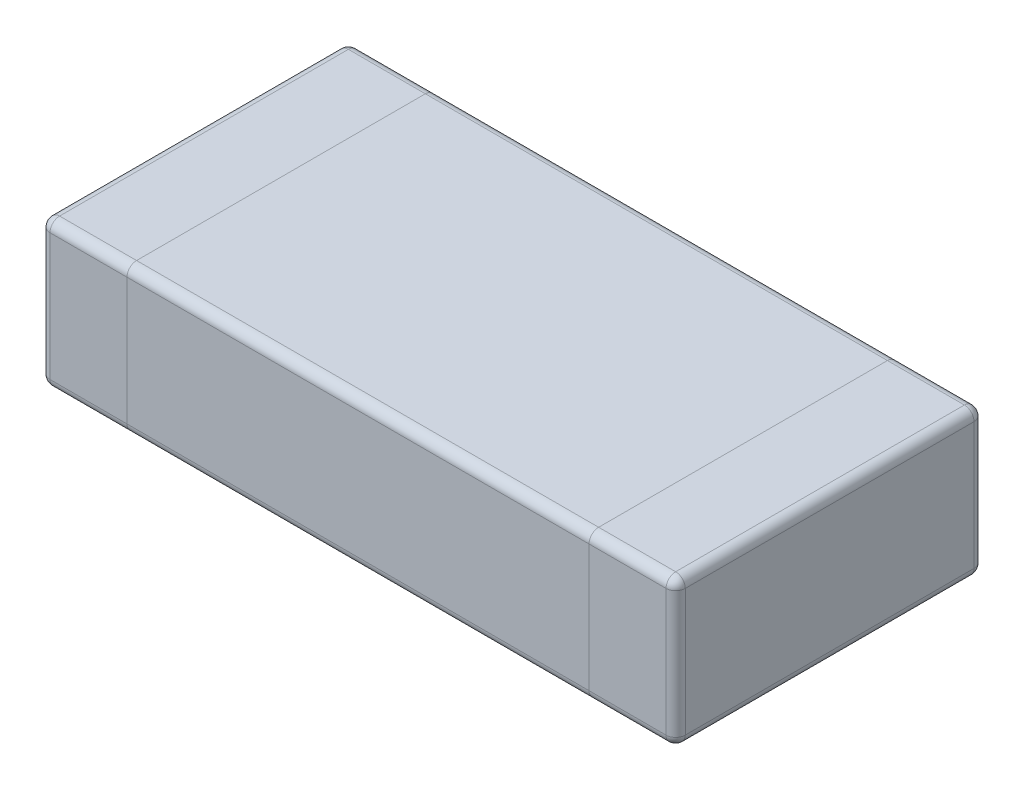
ISO-10303-21;
HEADER;
FILE_DESCRIPTION(('STEP AP214'),'2;1');
FILE_NAME('part.step','',(''),(''),'','','');
FILE_SCHEMA(('AUTOMOTIVE_DESIGN { 1 0 10303 214 1 1 1 1 }'));
ENDSEC;
DATA;
#1=APPLICATION_CONTEXT('core data for automotive mechanical design processes');
#2=APPLICATION_PROTOCOL_DEFINITION('international standard','automotive_design',2000,#1);
#3=PRODUCT_CONTEXT('',#1,'mechanical');
#4=PRODUCT('Part','Part','',(#3));
#5=PRODUCT_RELATED_PRODUCT_CATEGORY('part','',(#4));
#6=PRODUCT_DEFINITION_FORMATION('','',#4);
#7=PRODUCT_DEFINITION_CONTEXT('part definition',#1,'design');
#8=PRODUCT_DEFINITION('design','',#6,#7);
#9=PRODUCT_DEFINITION_SHAPE('','',#8);
#10=(LENGTH_UNIT() NAMED_UNIT(*) SI_UNIT(.MILLI.,.METRE.));
#11=(NAMED_UNIT(*) PLANE_ANGLE_UNIT() SI_UNIT($,.RADIAN.));
#12=(NAMED_UNIT(*) SI_UNIT($,.STERADIAN.) SOLID_ANGLE_UNIT());
#13=UNCERTAINTY_MEASURE_WITH_UNIT(LENGTH_MEASURE(1.E-05),#10,'distance_accuracy_value','');
#14=(GEOMETRIC_REPRESENTATION_CONTEXT(3) GLOBAL_UNCERTAINTY_ASSIGNED_CONTEXT((#13)) GLOBAL_UNIT_ASSIGNED_CONTEXT((#10,
#11,#12)) REPRESENTATION_CONTEXT('',''));
#15=CARTESIAN_POINT('',(0.,0.,0.));
#16=DIRECTION('',(0.,0.,1.));
#17=DIRECTION('',(1.,0.,0.));
#18=AXIS2_PLACEMENT_3D('',#15,#16,#17);
#19=CARTESIAN_POINT('',(1.6,0.76,-0.75));
#20=DIRECTION('',(0.,-1.,0.));
#21=DIRECTION('',(0.,0.,-1.));
#22=AXIS2_PLACEMENT_3D('',#19,#20,#21);
#23=CYLINDRICAL_SURFACE('',#22,0.05);
#24=CARTESIAN_POINT('',(1.6,0.71,-0.75));
#25=DIRECTION('',(0.,-1.,0.));
#26=DIRECTION('',(0.,0.,1.));
#27=AXIS2_PLACEMENT_3D('',#24,#25,#26);
#28=CIRCLE('',#27,0.05);
#29=CARTESIAN_POINT('',(1.6,0.71,-0.8));
#30=VERTEX_POINT('',#29);
#31=CARTESIAN_POINT('',(1.65,0.71,-0.75));
#32=VERTEX_POINT('',#31);
#33=EDGE_CURVE('E27',#30,#32,#28,.T.);
#34=ORIENTED_EDGE('',*,*,#33,.T.);
#35=DIRECTION('',(0.,1.,0.));
#36=VECTOR('',#35,1.);
#37=CARTESIAN_POINT('',(1.65,0.76,-0.75));
#38=LINE('',#37,#36);
#39=CARTESIAN_POINT('',(1.65,0.05,-0.75));
#40=VERTEX_POINT('',#39);
#41=EDGE_CURVE('E265',#40,#32,#38,.T.);
#42=ORIENTED_EDGE('',*,*,#41,.F.);
#43=CARTESIAN_POINT('',(1.6,0.05,-0.75));
#44=DIRECTION('',(0.,1.,0.));
#45=DIRECTION('',(0.,0.,-1.));
#46=AXIS2_PLACEMENT_3D('',#43,#44,#45);
#47=CIRCLE('',#46,0.05);
#48=CARTESIAN_POINT('',(1.6,0.05,-0.8));
#49=VERTEX_POINT('',#48);
#50=EDGE_CURVE('E11',#40,#49,#47,.T.);
#51=ORIENTED_EDGE('',*,*,#50,.T.);
#52=DIRECTION('',(0.,-1.,0.));
#53=VECTOR('',#52,1.);
#54=CARTESIAN_POINT('',(1.6,0.76,-0.8));
#55=LINE('',#54,#53);
#56=EDGE_CURVE('E261',#30,#49,#55,.T.);
#57=ORIENTED_EDGE('',*,*,#56,.F.);
#58=EDGE_LOOP('',(#34,#42,#51,#57));
#59=FACE_BOUND('',#58,.T.);
#60=ADVANCED_FACE('F16',(#59),#23,.T.);
#61=CARTESIAN_POINT('',(1.6,0.05,-0.75));
#62=DIRECTION('',(0.,1.,0.));
#63=DIRECTION('',(1.,0.,0.));
#64=AXIS2_PLACEMENT_3D('',#61,#62,#63);
#65=SPHERICAL_SURFACE('',#64,0.05);
#66=CARTESIAN_POINT('',(1.6,0.05,-0.75));
#67=DIRECTION('',(0.,0.,-1.));
#68=DIRECTION('',(-1.,0.,0.));
#69=AXIS2_PLACEMENT_3D('',#66,#67,#68);
#70=CIRCLE('',#69,0.05);
#71=CARTESIAN_POINT('',(1.6,0.,-0.75));
#72=VERTEX_POINT('',#71);
#73=EDGE_CURVE('E284',#40,#72,#70,.T.);
#74=ORIENTED_EDGE('',*,*,#73,.T.);
#75=CARTESIAN_POINT('',(1.6,0.05,-0.75));
#76=DIRECTION('',(1.,0.,0.));
#77=DIRECTION('',(0.,0.,-1.));
#78=AXIS2_PLACEMENT_3D('',#75,#76,#77);
#79=CIRCLE('',#78,0.05);
#80=EDGE_CURVE('E234',#72,#49,#79,.T.);
#81=ORIENTED_EDGE('',*,*,#80,.T.);
#82=ORIENTED_EDGE('',*,*,#50,.F.);
#83=EDGE_LOOP('',(#74,#81,#82));
#84=FACE_BOUND('',#83,.T.);
#85=ADVANCED_FACE('F635',(#84),#65,.T.);
#86=CARTESIAN_POINT('',(1.6,0.71,-0.75));
#87=DIRECTION('',(0.,1.,0.));
#88=DIRECTION('',(1.,0.,0.));
#89=AXIS2_PLACEMENT_3D('',#86,#87,#88);
#90=SPHERICAL_SURFACE('',#89,0.05);
#91=CARTESIAN_POINT('',(1.6,0.71,-0.75));
#92=DIRECTION('',(1.,0.,0.));
#93=DIRECTION('',(0.,1.,0.));
#94=AXIS2_PLACEMENT_3D('',#91,#92,#93);
#95=CIRCLE('',#94,0.05);
#96=CARTESIAN_POINT('',(1.6,0.76,-0.75));
#97=VERTEX_POINT('',#96);
#98=EDGE_CURVE('E387',#30,#97,#95,.T.);
#99=ORIENTED_EDGE('',*,*,#98,.T.);
#100=CARTESIAN_POINT('',(1.6,0.71,-0.75));
#101=DIRECTION('',(0.,0.,-1.));
#102=DIRECTION('',(-1.,0.,0.));
#103=AXIS2_PLACEMENT_3D('',#100,#101,#102);
#104=CIRCLE('',#103,0.05);
#105=EDGE_CURVE('E280',#97,#32,#104,.T.);
#106=ORIENTED_EDGE('',*,*,#105,.T.);
#107=ORIENTED_EDGE('',*,*,#33,.F.);
#108=EDGE_LOOP('',(#99,#106,#107));
#109=FACE_BOUND('',#108,.T.);
#110=ADVANCED_FACE('F641',(#109),#90,.T.);
#111=CARTESIAN_POINT('',(1.6,0.05,0.8));
#112=DIRECTION('',(0.,0.,1.));
#113=DIRECTION('',(1.,0.,0.));
#114=AXIS2_PLACEMENT_3D('',#111,#112,#113);
#115=CYLINDRICAL_SURFACE('',#114,0.05);
#116=CARTESIAN_POINT('',(1.6,0.05,0.75));
#117=DIRECTION('',(0.,0.,-1.));
#118=DIRECTION('',(1.,0.,0.));
#119=AXIS2_PLACEMENT_3D('',#116,#117,#118);
#120=CIRCLE('',#119,0.05);
#121=CARTESIAN_POINT('',(1.65,0.05,0.75));
#122=VERTEX_POINT('',#121);
#123=CARTESIAN_POINT('',(1.6,0.,0.75));
#124=VERTEX_POINT('',#123);
#125=EDGE_CURVE('E285',#122,#124,#120,.T.);
#126=ORIENTED_EDGE('',*,*,#125,.T.);
#127=DIRECTION('',(0.,0.,1.));
#128=VECTOR('',#127,1.);
#129=CARTESIAN_POINT('',(1.6,0.,0.8));
#130=LINE('',#129,#128);
#131=EDGE_CURVE('E239',#72,#124,#130,.T.);
#132=ORIENTED_EDGE('',*,*,#131,.F.);
#133=ORIENTED_EDGE('',*,*,#73,.F.);
#134=DIRECTION('',(0.,0.,-1.));
#135=VECTOR('',#134,1.);
#136=CARTESIAN_POINT('',(1.65,0.05,-0.8));
#137=LINE('',#136,#135);
#138=EDGE_CURVE('E335',#122,#40,#137,.T.);
#139=ORIENTED_EDGE('',*,*,#138,.F.);
#140=EDGE_LOOP('',(#126,#132,#133,#139));
#141=FACE_BOUND('',#140,.T.);
#142=ADVANCED_FACE('F542',(#141),#115,.T.);
#143=CARTESIAN_POINT('',(-1.65,0.05,-0.75));
#144=DIRECTION('',(1.,0.,0.));
#145=DIRECTION('',(0.,0.,-1.));
#146=AXIS2_PLACEMENT_3D('',#143,#144,#145);
#147=CYLINDRICAL_SURFACE('',#146,0.05);
#148=CARTESIAN_POINT('',(-1.2,0.05,-0.75));
#149=DIRECTION('',(-1.,0.,0.));
#150=DIRECTION('',(0.,0.,-1.));
#151=AXIS2_PLACEMENT_3D('',#148,#149,#150);
#152=CIRCLE('',#151,0.05);
#153=CARTESIAN_POINT('',(-1.2,0.05,-0.8));
#154=VERTEX_POINT('',#153);
#155=CARTESIAN_POINT('',(-1.2,0.,-0.75));
#156=VERTEX_POINT('',#155);
#157=EDGE_CURVE('E386',#154,#156,#152,.T.);
#158=ORIENTED_EDGE('',*,*,#157,.F.);
#159=DIRECTION('',(-1.,0.,0.));
#160=VECTOR('',#159,1.);
#161=CARTESIAN_POINT('',(-1.65,0.05,-0.8));
#162=LINE('',#161,#160);
#163=CARTESIAN_POINT('',(1.2,0.05,-0.8));
#164=VERTEX_POINT('',#163);
#165=EDGE_CURVE('E221',#164,#154,#162,.T.);
#166=ORIENTED_EDGE('',*,*,#165,.F.);
#167=CARTESIAN_POINT('',(1.2,0.05,-0.75));
#168=DIRECTION('',(1.,0.,0.));
#169=DIRECTION('',(0.,0.,1.));
#170=AXIS2_PLACEMENT_3D('',#167,#168,#169);
#171=CIRCLE('',#170,0.05);
#172=CARTESIAN_POINT('',(1.2,0.,-0.75));
#173=VERTEX_POINT('',#172);
#174=EDGE_CURVE('E218',#173,#164,#171,.T.);
#175=ORIENTED_EDGE('',*,*,#174,.F.);
#176=DIRECTION('',(1.,0.,0.));
#177=VECTOR('',#176,1.);
#178=CARTESIAN_POINT('',(1.65,0.,-0.75));
#179=LINE('',#178,#177);
#180=EDGE_CURVE('E202',#156,#173,#179,.T.);
#181=ORIENTED_EDGE('',*,*,#180,.F.);
#182=EDGE_LOOP('',(#158,#166,#175,#181));
#183=FACE_BOUND('',#182,.T.);
#184=ADVANCED_FACE('F220',(#183),#147,.T.);
#185=CARTESIAN_POINT('',(1.65,0.71,-0.75));
#186=DIRECTION('',(-1.,0.,0.));
#187=DIRECTION('',(0.,0.,1.));
#188=AXIS2_PLACEMENT_3D('',#185,#186,#187);
#189=CYLINDRICAL_SURFACE('',#188,0.05);
#190=CARTESIAN_POINT('',(-1.2,0.71,-0.75));
#191=DIRECTION('',(-1.,0.,0.));
#192=DIRECTION('',(0.,0.,-1.));
#193=AXIS2_PLACEMENT_3D('',#190,#191,#192);
#194=CIRCLE('',#193,0.05);
#195=CARTESIAN_POINT('',(-1.2,0.76,-0.75));
#196=VERTEX_POINT('',#195);
#197=CARTESIAN_POINT('',(-1.2,0.71,-0.8));
#198=VERTEX_POINT('',#197);
#199=EDGE_CURVE('E459',#196,#198,#194,.T.);
#200=ORIENTED_EDGE('',*,*,#199,.F.);
#201=DIRECTION('',(-1.,0.,0.));
#202=VECTOR('',#201,1.);
#203=CARTESIAN_POINT('',(1.65,0.76,-0.75));
#204=LINE('',#203,#202);
#205=CARTESIAN_POINT('',(1.2,0.76,-0.75));
#206=VERTEX_POINT('',#205);
#207=EDGE_CURVE('E269',#206,#196,#204,.T.);
#208=ORIENTED_EDGE('',*,*,#207,.F.);
#209=CARTESIAN_POINT('',(1.2,0.71,-0.75));
#210=DIRECTION('',(1.,0.,0.));
#211=DIRECTION('',(0.,0.,1.));
#212=AXIS2_PLACEMENT_3D('',#209,#210,#211);
#213=CIRCLE('',#212,0.05);
#214=CARTESIAN_POINT('',(1.2,0.71,-0.8));
#215=VERTEX_POINT('',#214);
#216=EDGE_CURVE('E333',#215,#206,#213,.T.);
#217=ORIENTED_EDGE('',*,*,#216,.F.);
#218=DIRECTION('',(1.,0.,0.));
#219=VECTOR('',#218,1.);
#220=CARTESIAN_POINT('',(-1.65,0.71,-0.8));
#221=LINE('',#220,#219);
#222=EDGE_CURVE('E258',#198,#215,#221,.T.);
#223=ORIENTED_EDGE('',*,*,#222,.F.);
#224=EDGE_LOOP('',(#200,#208,#217,#223));
#225=FACE_BOUND('',#224,.T.);
#226=ADVANCED_FACE('F588',(#225),#189,.T.);
#227=CARTESIAN_POINT('',(1.6,0.71,-0.8));
#228=DIRECTION('',(0.,0.,-1.));
#229=DIRECTION('',(-1.,0.,0.));
#230=AXIS2_PLACEMENT_3D('',#227,#228,#229);
#231=CYLINDRICAL_SURFACE('',#230,0.05);
#232=CARTESIAN_POINT('',(1.6,0.71,0.75));
#233=DIRECTION('',(0.,0.,-1.));
#234=DIRECTION('',(0.,-1.,0.));
#235=AXIS2_PLACEMENT_3D('',#232,#233,#234);
#236=CIRCLE('',#235,0.05);
#237=CARTESIAN_POINT('',(1.6,0.76,0.75));
#238=VERTEX_POINT('',#237);
#239=CARTESIAN_POINT('',(1.65,0.71,0.75));
#240=VERTEX_POINT('',#239);
#241=EDGE_CURVE('E306',#238,#240,#236,.T.);
#242=ORIENTED_EDGE('',*,*,#241,.T.);
#243=DIRECTION('',(0.,0.,1.));
#244=VECTOR('',#243,1.);
#245=CARTESIAN_POINT('',(1.65,0.71,0.8));
#246=LINE('',#245,#244);
#247=EDGE_CURVE('E362',#32,#240,#246,.T.);
#248=ORIENTED_EDGE('',*,*,#247,.F.);
#249=ORIENTED_EDGE('',*,*,#105,.F.);
#250=DIRECTION('',(0.,0.,-1.));
#251=VECTOR('',#250,1.);
#252=CARTESIAN_POINT('',(1.6,0.76,-0.8));
#253=LINE('',#252,#251);
#254=EDGE_CURVE('E314',#238,#97,#253,.T.);
#255=ORIENTED_EDGE('',*,*,#254,.F.);
#256=EDGE_LOOP('',(#242,#248,#249,#255));
#257=FACE_BOUND('',#256,.T.);
#258=ADVANCED_FACE('F548',(#257),#231,.T.);
#259=CARTESIAN_POINT('',(1.6,0.05,0.75));
#260=DIRECTION('',(0.,1.,0.));
#261=DIRECTION('',(1.,0.,0.));
#262=AXIS2_PLACEMENT_3D('',#259,#260,#261);
#263=SPHERICAL_SURFACE('',#262,0.05);
#264=CARTESIAN_POINT('',(1.6,0.05,0.75));
#265=DIRECTION('',(0.,-1.,0.));
#266=DIRECTION('',(0.,0.,-1.));
#267=AXIS2_PLACEMENT_3D('',#264,#265,#266);
#268=CIRCLE('',#267,0.05);
#269=CARTESIAN_POINT('',(1.6,0.05,0.8));
#270=VERTEX_POINT('',#269);
#271=EDGE_CURVE('E167',#122,#270,#268,.T.);
#272=ORIENTED_EDGE('',*,*,#271,.T.);
#273=CARTESIAN_POINT('',(1.6,0.05,0.75));
#274=DIRECTION('',(1.,0.,0.));
#275=DIRECTION('',(0.,0.,-1.));
#276=AXIS2_PLACEMENT_3D('',#273,#274,#275);
#277=CIRCLE('',#276,0.05);
#278=EDGE_CURVE('E302',#270,#124,#277,.T.);
#279=ORIENTED_EDGE('',*,*,#278,.T.);
#280=ORIENTED_EDGE('',*,*,#125,.F.);
#281=EDGE_LOOP('',(#272,#279,#280));
#282=FACE_BOUND('',#281,.T.);
#283=ADVANCED_FACE('F537',(#282),#263,.T.);
#284=CARTESIAN_POINT('',(-1.6,0.05,-0.75));
#285=DIRECTION('',(0.,1.,0.));
#286=DIRECTION('',(1.,0.,0.));
#287=AXIS2_PLACEMENT_3D('',#284,#285,#286);
#288=SPHERICAL_SURFACE('',#287,0.05);
#289=CARTESIAN_POINT('',(-1.6,0.05,-0.75));
#290=DIRECTION('',(0.,0.,-1.));
#291=DIRECTION('',(-1.,0.,0.));
#292=AXIS2_PLACEMENT_3D('',#289,#290,#291);
#293=CIRCLE('',#292,0.05);
#294=CARTESIAN_POINT('',(-1.6,0.,-0.75));
#295=VERTEX_POINT('',#294);
#296=CARTESIAN_POINT('',(-1.65,0.05,-0.75));
#297=VERTEX_POINT('',#296);
#298=EDGE_CURVE('E41',#295,#297,#293,.T.);
#299=ORIENTED_EDGE('',*,*,#298,.T.);
#300=CARTESIAN_POINT('',(-1.6,0.05,-0.75));
#301=DIRECTION('',(0.,-1.,0.));
#302=DIRECTION('',(0.,0.,-1.));
#303=AXIS2_PLACEMENT_3D('',#300,#301,#302);
#304=CIRCLE('',#303,0.05);
#305=CARTESIAN_POINT('',(-1.6,0.05,-0.8));
#306=VERTEX_POINT('',#305);
#307=EDGE_CURVE('E427',#297,#306,#304,.T.);
#308=ORIENTED_EDGE('',*,*,#307,.T.);
#309=CARTESIAN_POINT('',(-1.6,0.05,-0.75));
#310=DIRECTION('',(1.,0.,0.));
#311=DIRECTION('',(0.,0.,1.));
#312=AXIS2_PLACEMENT_3D('',#309,#310,#311);
#313=CIRCLE('',#312,0.05);
#314=EDGE_CURVE('E227',#295,#306,#313,.T.);
#315=ORIENTED_EDGE('',*,*,#314,.F.);
#316=EDGE_LOOP('',(#299,#308,#315));
#317=FACE_BOUND('',#316,.T.);
#318=ADVANCED_FACE('F598',(#317),#288,.T.);
#319=CARTESIAN_POINT('',(-1.6,0.71,-0.75));
#320=DIRECTION('',(0.,1.,0.));
#321=DIRECTION('',(1.,0.,0.));
#322=AXIS2_PLACEMENT_3D('',#319,#320,#321);
#323=SPHERICAL_SURFACE('',#322,0.05);
#324=CARTESIAN_POINT('',(-1.6,0.71,-0.75));
#325=DIRECTION('',(0.,1.,0.));
#326=DIRECTION('',(0.,0.,1.));
#327=AXIS2_PLACEMENT_3D('',#324,#325,#326);
#328=CIRCLE('',#327,0.05);
#329=CARTESIAN_POINT('',(-1.6,0.71,-0.8));
#330=VERTEX_POINT('',#329);
#331=CARTESIAN_POINT('',(-1.65,0.71,-0.75));
#332=VERTEX_POINT('',#331);
#333=EDGE_CURVE('E395',#330,#332,#328,.T.);
#334=ORIENTED_EDGE('',*,*,#333,.T.);
#335=CARTESIAN_POINT('',(-1.6,0.71,-0.75));
#336=DIRECTION('',(0.,0.,-1.));
#337=DIRECTION('',(0.,1.,0.));
#338=AXIS2_PLACEMENT_3D('',#335,#336,#337);
#339=CIRCLE('',#338,0.05);
#340=CARTESIAN_POINT('',(-1.6,0.76,-0.75));
#341=VERTEX_POINT('',#340);
#342=EDGE_CURVE('E325',#332,#341,#339,.T.);
#343=ORIENTED_EDGE('',*,*,#342,.T.);
#344=CARTESIAN_POINT('',(-1.6,0.71,-0.75));
#345=DIRECTION('',(1.,0.,0.));
#346=DIRECTION('',(0.,0.,1.));
#347=AXIS2_PLACEMENT_3D('',#344,#345,#346);
#348=CIRCLE('',#347,0.05);
#349=EDGE_CURVE('E334',#330,#341,#348,.T.);
#350=ORIENTED_EDGE('',*,*,#349,.F.);
#351=EDGE_LOOP('',(#334,#343,#350));
#352=FACE_BOUND('',#351,.T.);
#353=ADVANCED_FACE('F658',(#352),#323,.T.);
#354=CARTESIAN_POINT('',(1.6,0.71,0.75));
#355=DIRECTION('',(0.,1.,0.));
#356=DIRECTION('',(1.,0.,0.));
#357=AXIS2_PLACEMENT_3D('',#354,#355,#356);
#358=SPHERICAL_SURFACE('',#357,0.05);
#359=CARTESIAN_POINT('',(1.6,0.71,0.75));
#360=DIRECTION('',(1.,0.,0.));
#361=DIRECTION('',(0.,0.,-1.));
#362=AXIS2_PLACEMENT_3D('',#359,#360,#361);
#363=CIRCLE('',#362,0.05);
#364=CARTESIAN_POINT('',(1.6,0.71,0.8));
#365=VERTEX_POINT('',#364);
#366=EDGE_CURVE('E20',#238,#365,#363,.T.);
#367=ORIENTED_EDGE('',*,*,#366,.T.);
#368=CARTESIAN_POINT('',(1.6,0.71,0.75));
#369=DIRECTION('',(0.,1.,0.));
#370=DIRECTION('',(0.,0.,1.));
#371=AXIS2_PLACEMENT_3D('',#368,#369,#370);
#372=CIRCLE('',#371,0.05);
#373=EDGE_CURVE('E270',#365,#240,#372,.T.);
#374=ORIENTED_EDGE('',*,*,#373,.T.);
#375=ORIENTED_EDGE('',*,*,#241,.F.);
#376=EDGE_LOOP('',(#367,#374,#375));
#377=FACE_BOUND('',#376,.T.);
#378=ADVANCED_FACE('F518',(#377),#358,.T.);
#379=CARTESIAN_POINT('',(1.6,0.76,0.75));
#380=DIRECTION('',(0.,-1.,0.));
#381=DIRECTION('',(0.,0.,-1.));
#382=AXIS2_PLACEMENT_3D('',#379,#380,#381);
#383=CYLINDRICAL_SURFACE('',#382,0.05);
#384=ORIENTED_EDGE('',*,*,#373,.F.);
#385=DIRECTION('',(0.,1.,0.));
#386=VECTOR('',#385,1.);
#387=CARTESIAN_POINT('',(1.6,0.76,0.8));
#388=LINE('',#387,#386);
#389=EDGE_CURVE('E345',#270,#365,#388,.T.);
#390=ORIENTED_EDGE('',*,*,#389,.F.);
#391=ORIENTED_EDGE('',*,*,#271,.F.);
#392=DIRECTION('',(0.,-1.,0.));
#393=VECTOR('',#392,1.);
#394=CARTESIAN_POINT('',(1.65,0.76,0.75));
#395=LINE('',#394,#393);
#396=EDGE_CURVE('E339',#240,#122,#395,.T.);
#397=ORIENTED_EDGE('',*,*,#396,.F.);
#398=EDGE_LOOP('',(#384,#390,#391,#397));
#399=FACE_BOUND('',#398,.T.);
#400=ADVANCED_FACE('F540',(#399),#383,.T.);
#401=CARTESIAN_POINT('',(-1.65,0.05,0.75));
#402=DIRECTION('',(-1.,0.,0.));
#403=DIRECTION('',(0.,0.,1.));
#404=AXIS2_PLACEMENT_3D('',#401,#402,#403);
#405=CYLINDRICAL_SURFACE('',#404,0.05);
#406=CARTESIAN_POINT('',(-1.2,0.05,0.75));
#407=DIRECTION('',(-1.,0.,0.));
#408=DIRECTION('',(0.,0.,-1.));
#409=AXIS2_PLACEMENT_3D('',#406,#407,#408);
#410=CIRCLE('',#409,0.05);
#411=CARTESIAN_POINT('',(-1.2,0.,0.75));
#412=VERTEX_POINT('',#411);
#413=CARTESIAN_POINT('',(-1.2,0.05,0.8));
#414=VERTEX_POINT('',#413);
#415=EDGE_CURVE('E344',#412,#414,#410,.T.);
#416=ORIENTED_EDGE('',*,*,#415,.F.);
#417=DIRECTION('',(-1.,0.,0.));
#418=VECTOR('',#417,1.);
#419=CARTESIAN_POINT('',(-1.65,0.,0.75));
#420=LINE('',#419,#418);
#421=CARTESIAN_POINT('',(1.2,0.,0.75));
#422=VERTEX_POINT('',#421);
#423=EDGE_CURVE('E158',#422,#412,#420,.T.);
#424=ORIENTED_EDGE('',*,*,#423,.F.);
#425=CARTESIAN_POINT('',(1.2,0.05,0.75));
#426=DIRECTION('',(1.,0.,0.));
#427=DIRECTION('',(0.,0.,1.));
#428=AXIS2_PLACEMENT_3D('',#425,#426,#427);
#429=CIRCLE('',#428,0.05);
#430=CARTESIAN_POINT('',(1.2,0.05,0.8));
#431=VERTEX_POINT('',#430);
#432=EDGE_CURVE('E303',#431,#422,#429,.T.);
#433=ORIENTED_EDGE('',*,*,#432,.F.);
#434=DIRECTION('',(1.,0.,0.));
#435=VECTOR('',#434,1.);
#436=CARTESIAN_POINT('',(1.65,0.05,0.8));
#437=LINE('',#436,#435);
#438=EDGE_CURVE('E349',#414,#431,#437,.T.);
#439=ORIENTED_EDGE('',*,*,#438,.F.);
#440=EDGE_LOOP('',(#416,#424,#433,#439));
#441=FACE_BOUND('',#440,.T.);
#442=ADVANCED_FACE('F534',(#441),#405,.T.);
#443=CARTESIAN_POINT('',(-1.6,0.05,0.8));
#444=DIRECTION('',(0.,0.,-1.));
#445=DIRECTION('',(-1.,0.,0.));
#446=AXIS2_PLACEMENT_3D('',#443,#444,#445);
#447=CYLINDRICAL_SURFACE('',#446,0.05);
#448=CARTESIAN_POINT('',(-1.6,0.05,0.75));
#449=DIRECTION('',(0.,0.,-1.));
#450=DIRECTION('',(1.,0.,0.));
#451=AXIS2_PLACEMENT_3D('',#448,#449,#450);
#452=CIRCLE('',#451,0.05);
#453=CARTESIAN_POINT('',(-1.6,0.,0.75));
#454=VERTEX_POINT('',#453);
#455=CARTESIAN_POINT('',(-1.65,0.05,0.75));
#456=VERTEX_POINT('',#455);
#457=EDGE_CURVE('E322',#454,#456,#452,.T.);
#458=ORIENTED_EDGE('',*,*,#457,.T.);
#459=DIRECTION('',(0.,0.,1.));
#460=VECTOR('',#459,1.);
#461=CARTESIAN_POINT('',(-1.65,0.05,0.8));
#462=LINE('',#461,#460);
#463=EDGE_CURVE('E350',#297,#456,#462,.T.);
#464=ORIENTED_EDGE('',*,*,#463,.F.);
#465=ORIENTED_EDGE('',*,*,#298,.F.);
#466=DIRECTION('',(0.,0.,-1.));
#467=VECTOR('',#466,1.);
#468=CARTESIAN_POINT('',(-1.6,0.,-0.8));
#469=LINE('',#468,#467);
#470=EDGE_CURVE('E246',#454,#295,#469,.T.);
#471=ORIENTED_EDGE('',*,*,#470,.F.);
#472=EDGE_LOOP('',(#458,#464,#465,#471));
#473=FACE_BOUND('',#472,.T.);
#474=ADVANCED_FACE('F606',(#473),#447,.T.);
#475=CARTESIAN_POINT('',(-1.6,0.76,-0.75));
#476=DIRECTION('',(0.,-1.,0.));
#477=DIRECTION('',(0.,0.,-1.));
#478=AXIS2_PLACEMENT_3D('',#475,#476,#477);
#479=CYLINDRICAL_SURFACE('',#478,0.05);
#480=ORIENTED_EDGE('',*,*,#307,.F.);
#481=DIRECTION('',(0.,-1.,0.));
#482=VECTOR('',#481,1.);
#483=CARTESIAN_POINT('',(-1.65,0.76,-0.75));
#484=LINE('',#483,#482);
#485=EDGE_CURVE('E502',#332,#297,#484,.T.);
#486=ORIENTED_EDGE('',*,*,#485,.F.);
#487=ORIENTED_EDGE('',*,*,#333,.F.);
#488=DIRECTION('',(0.,1.,0.));
#489=VECTOR('',#488,1.);
#490=CARTESIAN_POINT('',(-1.6,0.76,-0.8));
#491=LINE('',#490,#489);
#492=EDGE_CURVE('E357',#306,#330,#491,.T.);
#493=ORIENTED_EDGE('',*,*,#492,.F.);
#494=EDGE_LOOP('',(#480,#486,#487,#493));
#495=FACE_BOUND('',#494,.T.);
#496=ADVANCED_FACE('F652',(#495),#479,.T.);
#497=CARTESIAN_POINT('',(-1.6,0.71,-0.8));
#498=DIRECTION('',(0.,0.,1.));
#499=DIRECTION('',(1.,0.,0.));
#500=AXIS2_PLACEMENT_3D('',#497,#498,#499);
#501=CYLINDRICAL_SURFACE('',#500,0.05);
#502=CARTESIAN_POINT('',(-1.6,0.71,0.75));
#503=DIRECTION('',(0.,0.,-1.));
#504=DIRECTION('',(1.,0.,0.));
#505=AXIS2_PLACEMENT_3D('',#502,#503,#504);
#506=CIRCLE('',#505,0.05);
#507=CARTESIAN_POINT('',(-1.65,0.71,0.75));
#508=VERTEX_POINT('',#507);
#509=CARTESIAN_POINT('',(-1.6,0.76,0.75));
#510=VERTEX_POINT('',#509);
#511=EDGE_CURVE('E326',#508,#510,#506,.T.);
#512=ORIENTED_EDGE('',*,*,#511,.T.);
#513=DIRECTION('',(0.,0.,1.));
#514=VECTOR('',#513,1.);
#515=CARTESIAN_POINT('',(-1.6,0.76,-0.8));
#516=LINE('',#515,#514);
#517=EDGE_CURVE('E292',#341,#510,#516,.T.);
#518=ORIENTED_EDGE('',*,*,#517,.F.);
#519=ORIENTED_EDGE('',*,*,#342,.F.);
#520=DIRECTION('',(0.,0.,-1.));
#521=VECTOR('',#520,1.);
#522=CARTESIAN_POINT('',(-1.65,0.71,0.8));
#523=LINE('',#522,#521);
#524=EDGE_CURVE('E474',#508,#332,#523,.T.);
#525=ORIENTED_EDGE('',*,*,#524,.F.);
#526=EDGE_LOOP('',(#512,#518,#519,#525));
#527=FACE_BOUND('',#526,.T.);
#528=ADVANCED_FACE('F573',(#527),#501,.T.);
#529=CARTESIAN_POINT('',(1.65,0.71,0.75));
#530=DIRECTION('',(1.,0.,0.));
#531=DIRECTION('',(0.,0.,-1.));
#532=AXIS2_PLACEMENT_3D('',#529,#530,#531);
#533=CYLINDRICAL_SURFACE('',#532,0.05);
#534=CARTESIAN_POINT('',(-1.2,0.71,0.75));
#535=DIRECTION('',(-1.,0.,0.));
#536=DIRECTION('',(0.,0.,-1.));
#537=AXIS2_PLACEMENT_3D('',#534,#535,#536);
#538=CIRCLE('',#537,0.05);
#539=CARTESIAN_POINT('',(-1.2,0.71,0.8));
#540=VERTEX_POINT('',#539);
#541=CARTESIAN_POINT('',(-1.2,0.76,0.75));
#542=VERTEX_POINT('',#541);
#543=EDGE_CURVE('E278',#540,#542,#538,.T.);
#544=ORIENTED_EDGE('',*,*,#543,.F.);
#545=DIRECTION('',(-1.,0.,0.));
#546=VECTOR('',#545,1.);
#547=CARTESIAN_POINT('',(-1.65,0.71,0.8));
#548=LINE('',#547,#546);
#549=CARTESIAN_POINT('',(1.2,0.71,0.8));
#550=VERTEX_POINT('',#549);
#551=EDGE_CURVE('E346',#550,#540,#548,.T.);
#552=ORIENTED_EDGE('',*,*,#551,.F.);
#553=CARTESIAN_POINT('',(1.2,0.71,0.75));
#554=DIRECTION('',(1.,0.,0.));
#555=DIRECTION('',(0.,0.,1.));
#556=AXIS2_PLACEMENT_3D('',#553,#554,#555);
#557=CIRCLE('',#556,0.05);
#558=CARTESIAN_POINT('',(1.2,0.76,0.75));
#559=VERTEX_POINT('',#558);
#560=EDGE_CURVE('E316',#559,#550,#557,.T.);
#561=ORIENTED_EDGE('',*,*,#560,.F.);
#562=DIRECTION('',(1.,0.,0.));
#563=VECTOR('',#562,1.);
#564=CARTESIAN_POINT('',(1.65,0.76,0.75));
#565=LINE('',#564,#563);
#566=EDGE_CURVE('E214',#542,#559,#565,.T.);
#567=ORIENTED_EDGE('',*,*,#566,.F.);
#568=EDGE_LOOP('',(#544,#552,#561,#567));
#569=FACE_BOUND('',#568,.T.);
#570=ADVANCED_FACE('F526',(#569),#533,.T.);
#571=CARTESIAN_POINT('',(-1.6,0.05,0.75));
#572=DIRECTION('',(0.,1.,0.));
#573=DIRECTION('',(1.,0.,0.));
#574=AXIS2_PLACEMENT_3D('',#571,#572,#573);
#575=SPHERICAL_SURFACE('',#574,0.05);
#576=CARTESIAN_POINT('',(-1.6,0.05,0.75));
#577=DIRECTION('',(1.,0.,0.));
#578=DIRECTION('',(0.,0.,1.));
#579=AXIS2_PLACEMENT_3D('',#576,#577,#578);
#580=CIRCLE('',#579,0.05);
#581=CARTESIAN_POINT('',(-1.6,0.05,0.8));
#582=VERTEX_POINT('',#581);
#583=EDGE_CURVE('E256',#582,#454,#580,.T.);
#584=ORIENTED_EDGE('',*,*,#583,.F.);
#585=CARTESIAN_POINT('',(-1.6,0.05,0.75));
#586=DIRECTION('',(0.,-1.,0.));
#587=DIRECTION('',(0.,0.,-1.));
#588=AXIS2_PLACEMENT_3D('',#585,#586,#587);
#589=CIRCLE('',#588,0.05);
#590=EDGE_CURVE('E375',#582,#456,#589,.T.);
#591=ORIENTED_EDGE('',*,*,#590,.T.);
#592=ORIENTED_EDGE('',*,*,#457,.F.);
#593=EDGE_LOOP('',(#584,#591,#592));
#594=FACE_BOUND('',#593,.T.);
#595=ADVANCED_FACE('F614',(#594),#575,.T.);
#596=CARTESIAN_POINT('',(-1.6,0.71,0.75));
#597=DIRECTION('',(0.,1.,0.));
#598=DIRECTION('',(1.,0.,0.));
#599=AXIS2_PLACEMENT_3D('',#596,#597,#598);
#600=SPHERICAL_SURFACE('',#599,0.05);
#601=ORIENTED_EDGE('',*,*,#511,.F.);
#602=CARTESIAN_POINT('',(-1.6,0.71,0.75));
#603=DIRECTION('',(0.,1.,0.));
#604=DIRECTION('',(0.,0.,1.));
#605=AXIS2_PLACEMENT_3D('',#602,#603,#604);
#606=CIRCLE('',#605,0.05);
#607=CARTESIAN_POINT('',(-1.6,0.71,0.8));
#608=VERTEX_POINT('',#607);
#609=EDGE_CURVE('E372',#508,#608,#606,.T.);
#610=ORIENTED_EDGE('',*,*,#609,.T.);
#611=CARTESIAN_POINT('',(-1.6,0.71,0.75));
#612=DIRECTION('',(1.,0.,0.));
#613=DIRECTION('',(0.,-1.,0.));
#614=AXIS2_PLACEMENT_3D('',#611,#612,#613);
#615=CIRCLE('',#614,0.05);
#616=EDGE_CURVE('E320',#510,#608,#615,.T.);
#617=ORIENTED_EDGE('',*,*,#616,.F.);
#618=EDGE_LOOP('',(#601,#610,#617));
#619=FACE_BOUND('',#618,.T.);
#620=ADVANCED_FACE('F578',(#619),#600,.T.);
#621=CARTESIAN_POINT('',(-1.6,0.76,0.75));
#622=DIRECTION('',(0.,-1.,0.));
#623=DIRECTION('',(0.,0.,-1.));
#624=AXIS2_PLACEMENT_3D('',#621,#622,#623);
#625=CYLINDRICAL_SURFACE('',#624,0.05);
#626=ORIENTED_EDGE('',*,*,#609,.F.);
#627=DIRECTION('',(0.,1.,0.));
#628=VECTOR('',#627,1.);
#629=CARTESIAN_POINT('',(-1.65,0.76,0.75));
#630=LINE('',#629,#628);
#631=EDGE_CURVE('E260',#456,#508,#630,.T.);
#632=ORIENTED_EDGE('',*,*,#631,.F.);
#633=ORIENTED_EDGE('',*,*,#590,.F.);
#634=DIRECTION('',(0.,-1.,0.));
#635=VECTOR('',#634,1.);
#636=CARTESIAN_POINT('',(-1.6,0.76,0.8));
#637=LINE('',#636,#635);
#638=EDGE_CURVE('E291',#608,#582,#637,.T.);
#639=ORIENTED_EDGE('',*,*,#638,.F.);
#640=EDGE_LOOP('',(#626,#632,#633,#639));
#641=FACE_BOUND('',#640,.T.);
#642=ADVANCED_FACE('F620',(#641),#625,.T.);
#643=CARTESIAN_POINT('',(1.65,0.,-0.8));
#644=DIRECTION('',(0.,-1.,0.));
#645=DIRECTION('',(0.,0.,-1.));
#646=AXIS2_PLACEMENT_3D('',#643,#644,#645);
#647=PLANE('',#646);
#648=DIRECTION('',(0.,0.,1.));
#649=VECTOR('',#648,1.);
#650=CARTESIAN_POINT('',(-1.2,0.,-0.8));
#651=LINE('',#650,#649);
#652=EDGE_CURVE('E208',#156,#412,#651,.T.);
#653=ORIENTED_EDGE('',*,*,#652,.F.);
#654=ORIENTED_EDGE('',*,*,#180,.T.);
#655=DIRECTION('',(0.,0.,-1.));
#656=VECTOR('',#655,1.);
#657=CARTESIAN_POINT('',(1.2,0.,-0.8));
#658=LINE('',#657,#656);
#659=EDGE_CURVE('E206',#422,#173,#658,.T.);
#660=ORIENTED_EDGE('',*,*,#659,.F.);
#661=ORIENTED_EDGE('',*,*,#423,.T.);
#662=EDGE_LOOP('',(#653,#654,#660,#661));
#663=FACE_BOUND('',#662,.T.);
#664=ADVANCED_FACE('F204',(#663),#647,.T.);
#665=CARTESIAN_POINT('',(1.65,0.76,-0.8));
#666=DIRECTION('',(0.,-1.,0.));
#667=DIRECTION('',(0.,0.,-1.));
#668=AXIS2_PLACEMENT_3D('',#665,#666,#667);
#669=PLANE('',#668);
#670=ORIENTED_EDGE('',*,*,#207,.T.);
#671=DIRECTION('',(0.,0.,1.));
#672=VECTOR('',#671,1.);
#673=CARTESIAN_POINT('',(-1.2,0.76,-0.8));
#674=LINE('',#673,#672);
#675=EDGE_CURVE('E379',#196,#542,#674,.T.);
#676=ORIENTED_EDGE('',*,*,#675,.T.);
#677=ORIENTED_EDGE('',*,*,#566,.T.);
#678=DIRECTION('',(0.,0.,-1.));
#679=VECTOR('',#678,1.);
#680=CARTESIAN_POINT('',(1.2,0.76,-0.8));
#681=LINE('',#680,#679);
#682=EDGE_CURVE('E315',#559,#206,#681,.T.);
#683=ORIENTED_EDGE('',*,*,#682,.T.);
#684=EDGE_LOOP('',(#670,#676,#677,#683));
#685=FACE_BOUND('',#684,.T.);
#686=ADVANCED_FACE('F670',(#685),#669,.F.);
#687=CARTESIAN_POINT('',(-1.65,0.76,0.8));
#688=DIRECTION('',(0.,0.,-1.));
#689=DIRECTION('',(0.,-1.,0.));
#690=AXIS2_PLACEMENT_3D('',#687,#688,#689);
#691=PLANE('',#690);
#692=ORIENTED_EDGE('',*,*,#551,.T.);
#693=DIRECTION('',(0.,-1.,0.));
#694=VECTOR('',#693,1.);
#695=CARTESIAN_POINT('',(-1.2,0.76,0.8));
#696=LINE('',#695,#694);
#697=EDGE_CURVE('E475',#540,#414,#696,.T.);
#698=ORIENTED_EDGE('',*,*,#697,.T.);
#699=ORIENTED_EDGE('',*,*,#438,.T.);
#700=DIRECTION('',(0.,1.,0.));
#701=VECTOR('',#700,1.);
#702=CARTESIAN_POINT('',(1.2,0.76,0.8));
#703=LINE('',#702,#701);
#704=EDGE_CURVE('E290',#431,#550,#703,.T.);
#705=ORIENTED_EDGE('',*,*,#704,.T.);
#706=EDGE_LOOP('',(#692,#698,#699,#705));
#707=FACE_BOUND('',#706,.T.);
#708=ADVANCED_FACE('F530',(#707),#691,.F.);
#709=CARTESIAN_POINT('',(-1.65,0.76,0.8));
#710=DIRECTION('',(1.,0.,0.));
#711=DIRECTION('',(0.,1.,0.));
#712=AXIS2_PLACEMENT_3D('',#709,#710,#711);
#713=PLANE('',#712);
#714=ORIENTED_EDGE('',*,*,#631,.T.);
#715=ORIENTED_EDGE('',*,*,#524,.T.);
#716=ORIENTED_EDGE('',*,*,#485,.T.);
#717=ORIENTED_EDGE('',*,*,#463,.T.);
#718=EDGE_LOOP('',(#714,#715,#716,#717));
#719=FACE_BOUND('',#718,.T.);
#720=ADVANCED_FACE('F618',(#719),#713,.F.);
#721=CARTESIAN_POINT('',(-1.65,0.76,-0.8));
#722=DIRECTION('',(0.,0.,1.));
#723=DIRECTION('',(1.,0.,0.));
#724=AXIS2_PLACEMENT_3D('',#721,#722,#723);
#725=PLANE('',#724);
#726=ORIENTED_EDGE('',*,*,#165,.T.);
#727=DIRECTION('',(0.,1.,0.));
#728=VECTOR('',#727,1.);
#729=CARTESIAN_POINT('',(-1.2,0.76,-0.8));
#730=LINE('',#729,#728);
#731=EDGE_CURVE('E361',#154,#198,#730,.T.);
#732=ORIENTED_EDGE('',*,*,#731,.T.);
#733=ORIENTED_EDGE('',*,*,#222,.T.);
#734=DIRECTION('',(0.,-1.,0.));
#735=VECTOR('',#734,1.);
#736=CARTESIAN_POINT('',(1.2,0.76,-0.8));
#737=LINE('',#736,#735);
#738=EDGE_CURVE('E266',#215,#164,#737,.T.);
#739=ORIENTED_EDGE('',*,*,#738,.T.);
#740=EDGE_LOOP('',(#726,#732,#733,#739));
#741=FACE_BOUND('',#740,.T.);
#742=ADVANCED_FACE('F593',(#741),#725,.F.);
#743=CARTESIAN_POINT('',(1.65,0.76,0.8));
#744=DIRECTION('',(-1.,0.,0.));
#745=DIRECTION('',(0.,0.,1.));
#746=AXIS2_PLACEMENT_3D('',#743,#744,#745);
#747=PLANE('',#746);
#748=ORIENTED_EDGE('',*,*,#41,.T.);
#749=ORIENTED_EDGE('',*,*,#247,.T.);
#750=ORIENTED_EDGE('',*,*,#396,.T.);
#751=ORIENTED_EDGE('',*,*,#138,.T.);
#752=EDGE_LOOP('',(#748,#749,#750,#751));
#753=FACE_BOUND('',#752,.T.);
#754=ADVANCED_FACE('F545',(#753),#747,.F.);
#755=CARTESIAN_POINT('',(-1.65,0.76,-0.8));
#756=DIRECTION('',(0.,0.,1.));
#757=DIRECTION('',(1.,0.,0.));
#758=AXIS2_PLACEMENT_3D('',#755,#756,#757);
#759=PLANE('',#758);
#760=ORIENTED_EDGE('',*,*,#738,.F.);
#761=DIRECTION('',(1.,0.,0.));
#762=VECTOR('',#761,1.);
#763=CARTESIAN_POINT('',(-1.65,0.71,-0.8));
#764=LINE('',#763,#762);
#765=EDGE_CURVE('E329',#215,#30,#764,.T.);
#766=ORIENTED_EDGE('',*,*,#765,.T.);
#767=ORIENTED_EDGE('',*,*,#56,.T.);
#768=DIRECTION('',(-1.,0.,0.));
#769=VECTOR('',#768,1.);
#770=CARTESIAN_POINT('',(-1.65,0.05,-0.8));
#771=LINE('',#770,#769);
#772=EDGE_CURVE('E226',#49,#164,#771,.T.);
#773=ORIENTED_EDGE('',*,*,#772,.T.);
#774=EDGE_LOOP('',(#760,#766,#767,#773));
#775=FACE_BOUND('',#774,.T.);
#776=ADVANCED_FACE('F675',(#775),#759,.F.);
#777=CARTESIAN_POINT('',(-1.65,0.76,-0.8));
#778=DIRECTION('',(0.,0.,1.));
#779=DIRECTION('',(1.,0.,0.));
#780=AXIS2_PLACEMENT_3D('',#777,#778,#779);
#781=PLANE('',#780);
#782=ORIENTED_EDGE('',*,*,#731,.F.);
#783=DIRECTION('',(-1.,0.,0.));
#784=VECTOR('',#783,1.);
#785=CARTESIAN_POINT('',(-1.65,0.05,-0.8));
#786=LINE('',#785,#784);
#787=EDGE_CURVE('E383',#154,#306,#786,.T.);
#788=ORIENTED_EDGE('',*,*,#787,.T.);
#789=ORIENTED_EDGE('',*,*,#492,.T.);
#790=DIRECTION('',(1.,0.,0.));
#791=VECTOR('',#790,1.);
#792=CARTESIAN_POINT('',(-1.65,0.71,-0.8));
#793=LINE('',#792,#791);
#794=EDGE_CURVE('E450',#330,#198,#793,.T.);
#795=ORIENTED_EDGE('',*,*,#794,.T.);
#796=EDGE_LOOP('',(#782,#788,#789,#795));
#797=FACE_BOUND('',#796,.T.);
#798=ADVANCED_FACE('F594',(#797),#781,.F.);
#799=CARTESIAN_POINT('',(-1.65,0.05,-0.75));
#800=DIRECTION('',(1.,0.,0.));
#801=DIRECTION('',(0.,0.,-1.));
#802=AXIS2_PLACEMENT_3D('',#799,#800,#801);
#803=CYLINDRICAL_SURFACE('',#802,0.05);
#804=DIRECTION('',(1.,0.,0.));
#805=VECTOR('',#804,1.);
#806=CARTESIAN_POINT('',(1.65,0.,-0.75));
#807=LINE('',#806,#805);
#808=EDGE_CURVE('E231',#173,#72,#807,.T.);
#809=ORIENTED_EDGE('',*,*,#808,.F.);
#810=ORIENTED_EDGE('',*,*,#174,.T.);
#811=ORIENTED_EDGE('',*,*,#772,.F.);
#812=ORIENTED_EDGE('',*,*,#80,.F.);
#813=EDGE_LOOP('',(#809,#810,#811,#812));
#814=FACE_BOUND('',#813,.T.);
#815=ADVANCED_FACE('F232',(#814),#803,.T.);
#816=CARTESIAN_POINT('',(-1.65,0.05,-0.75));
#817=DIRECTION('',(1.,0.,0.));
#818=DIRECTION('',(0.,0.,-1.));
#819=AXIS2_PLACEMENT_3D('',#816,#817,#818);
#820=CYLINDRICAL_SURFACE('',#819,0.05);
#821=ORIENTED_EDGE('',*,*,#787,.F.);
#822=ORIENTED_EDGE('',*,*,#157,.T.);
#823=DIRECTION('',(1.,0.,0.));
#824=VECTOR('',#823,1.);
#825=CARTESIAN_POINT('',(1.65,0.,-0.75));
#826=LINE('',#825,#824);
#827=EDGE_CURVE('E309',#295,#156,#826,.T.);
#828=ORIENTED_EDGE('',*,*,#827,.F.);
#829=ORIENTED_EDGE('',*,*,#314,.T.);
#830=EDGE_LOOP('',(#821,#822,#828,#829));
#831=FACE_BOUND('',#830,.T.);
#832=ADVANCED_FACE('F18',(#831),#820,.T.);
#833=CARTESIAN_POINT('',(1.65,0.71,-0.75));
#834=DIRECTION('',(-1.,0.,0.));
#835=DIRECTION('',(0.,0.,1.));
#836=AXIS2_PLACEMENT_3D('',#833,#834,#835);
#837=CYLINDRICAL_SURFACE('',#836,0.05);
#838=ORIENTED_EDGE('',*,*,#765,.F.);
#839=ORIENTED_EDGE('',*,*,#216,.T.);
#840=DIRECTION('',(-1.,0.,0.));
#841=VECTOR('',#840,1.);
#842=CARTESIAN_POINT('',(1.65,0.76,-0.75));
#843=LINE('',#842,#841);
#844=EDGE_CURVE('E279',#97,#206,#843,.T.);
#845=ORIENTED_EDGE('',*,*,#844,.F.);
#846=ORIENTED_EDGE('',*,*,#98,.F.);
#847=EDGE_LOOP('',(#838,#839,#845,#846));
#848=FACE_BOUND('',#847,.T.);
#849=ADVANCED_FACE('F694',(#848),#837,.T.);
#850=CARTESIAN_POINT('',(1.65,0.71,-0.75));
#851=DIRECTION('',(-1.,0.,0.));
#852=DIRECTION('',(0.,0.,1.));
#853=AXIS2_PLACEMENT_3D('',#850,#851,#852);
#854=CYLINDRICAL_SURFACE('',#853,0.05);
#855=DIRECTION('',(-1.,0.,0.));
#856=VECTOR('',#855,1.);
#857=CARTESIAN_POINT('',(1.65,0.76,-0.75));
#858=LINE('',#857,#856);
#859=EDGE_CURVE('E297',#196,#341,#858,.T.);
#860=ORIENTED_EDGE('',*,*,#859,.F.);
#861=ORIENTED_EDGE('',*,*,#199,.T.);
#862=ORIENTED_EDGE('',*,*,#794,.F.);
#863=ORIENTED_EDGE('',*,*,#349,.T.);
#864=EDGE_LOOP('',(#860,#861,#862,#863));
#865=FACE_BOUND('',#864,.T.);
#866=ADVANCED_FACE('F585',(#865),#854,.T.);
#867=CARTESIAN_POINT('',(1.65,0.,-0.8));
#868=DIRECTION('',(0.,-1.,0.));
#869=DIRECTION('',(0.,0.,-1.));
#870=AXIS2_PLACEMENT_3D('',#867,#868,#869);
#871=PLANE('',#870);
#872=DIRECTION('',(-1.,0.,0.));
#873=VECTOR('',#872,1.);
#874=CARTESIAN_POINT('',(-1.65,0.,0.75));
#875=LINE('',#874,#873);
#876=EDGE_CURVE('E243',#124,#422,#875,.T.);
#877=ORIENTED_EDGE('',*,*,#876,.T.);
#878=ORIENTED_EDGE('',*,*,#659,.T.);
#879=ORIENTED_EDGE('',*,*,#808,.T.);
#880=ORIENTED_EDGE('',*,*,#131,.T.);
#881=EDGE_LOOP('',(#877,#878,#879,#880));
#882=FACE_BOUND('',#881,.T.);
#883=ADVANCED_FACE('F241',(#882),#871,.T.);
#884=CARTESIAN_POINT('',(1.65,0.,-0.8));
#885=DIRECTION('',(0.,-1.,0.));
#886=DIRECTION('',(0.,0.,-1.));
#887=AXIS2_PLACEMENT_3D('',#884,#885,#886);
#888=PLANE('',#887);
#889=ORIENTED_EDGE('',*,*,#827,.T.);
#890=ORIENTED_EDGE('',*,*,#652,.T.);
#891=DIRECTION('',(-1.,0.,0.));
#892=VECTOR('',#891,1.);
#893=CARTESIAN_POINT('',(-1.65,0.,0.75));
#894=LINE('',#893,#892);
#895=EDGE_CURVE('E340',#412,#454,#894,.T.);
#896=ORIENTED_EDGE('',*,*,#895,.T.);
#897=ORIENTED_EDGE('',*,*,#470,.T.);
#898=EDGE_LOOP('',(#889,#890,#896,#897));
#899=FACE_BOUND('',#898,.T.);
#900=ADVANCED_FACE('F602',(#899),#888,.T.);
#901=CARTESIAN_POINT('',(-1.65,0.05,0.75));
#902=DIRECTION('',(-1.,0.,0.));
#903=DIRECTION('',(0.,0.,1.));
#904=AXIS2_PLACEMENT_3D('',#901,#902,#903);
#905=CYLINDRICAL_SURFACE('',#904,0.05);
#906=DIRECTION('',(1.,0.,0.));
#907=VECTOR('',#906,1.);
#908=CARTESIAN_POINT('',(1.65,0.05,0.8));
#909=LINE('',#908,#907);
#910=EDGE_CURVE('E354',#431,#270,#909,.T.);
#911=ORIENTED_EDGE('',*,*,#910,.F.);
#912=ORIENTED_EDGE('',*,*,#432,.T.);
#913=ORIENTED_EDGE('',*,*,#876,.F.);
#914=ORIENTED_EDGE('',*,*,#278,.F.);
#915=EDGE_LOOP('',(#911,#912,#913,#914));
#916=FACE_BOUND('',#915,.T.);
#917=ADVANCED_FACE('F536',(#916),#905,.T.);
#918=CARTESIAN_POINT('',(-1.65,0.05,0.75));
#919=DIRECTION('',(-1.,0.,0.));
#920=DIRECTION('',(0.,0.,1.));
#921=AXIS2_PLACEMENT_3D('',#918,#919,#920);
#922=CYLINDRICAL_SURFACE('',#921,0.05);
#923=ORIENTED_EDGE('',*,*,#895,.F.);
#924=ORIENTED_EDGE('',*,*,#415,.T.);
#925=DIRECTION('',(1.,0.,0.));
#926=VECTOR('',#925,1.);
#927=CARTESIAN_POINT('',(1.65,0.05,0.8));
#928=LINE('',#927,#926);
#929=EDGE_CURVE('E286',#582,#414,#928,.T.);
#930=ORIENTED_EDGE('',*,*,#929,.F.);
#931=ORIENTED_EDGE('',*,*,#583,.T.);
#932=EDGE_LOOP('',(#923,#924,#930,#931));
#933=FACE_BOUND('',#932,.T.);
#934=ADVANCED_FACE('F611',(#933),#922,.T.);
#935=CARTESIAN_POINT('',(-1.65,0.76,0.8));
#936=DIRECTION('',(0.,0.,-1.));
#937=DIRECTION('',(0.,-1.,0.));
#938=AXIS2_PLACEMENT_3D('',#935,#936,#937);
#939=PLANE('',#938);
#940=ORIENTED_EDGE('',*,*,#704,.F.);
#941=ORIENTED_EDGE('',*,*,#910,.T.);
#942=ORIENTED_EDGE('',*,*,#389,.T.);
#943=DIRECTION('',(-1.,0.,0.));
#944=VECTOR('',#943,1.);
#945=CARTESIAN_POINT('',(-1.65,0.71,0.8));
#946=LINE('',#945,#944);
#947=EDGE_CURVE('E319',#365,#550,#946,.T.);
#948=ORIENTED_EDGE('',*,*,#947,.T.);
#949=EDGE_LOOP('',(#940,#941,#942,#948));
#950=FACE_BOUND('',#949,.T.);
#951=ADVANCED_FACE('F512',(#950),#939,.F.);
#952=CARTESIAN_POINT('',(-1.65,0.76,0.8));
#953=DIRECTION('',(0.,0.,-1.));
#954=DIRECTION('',(0.,-1.,0.));
#955=AXIS2_PLACEMENT_3D('',#952,#953,#954);
#956=PLANE('',#955);
#957=ORIENTED_EDGE('',*,*,#697,.F.);
#958=DIRECTION('',(-1.,0.,0.));
#959=VECTOR('',#958,1.);
#960=CARTESIAN_POINT('',(-1.65,0.71,0.8));
#961=LINE('',#960,#959);
#962=EDGE_CURVE('E274',#540,#608,#961,.T.);
#963=ORIENTED_EDGE('',*,*,#962,.T.);
#964=ORIENTED_EDGE('',*,*,#638,.T.);
#965=ORIENTED_EDGE('',*,*,#929,.T.);
#966=EDGE_LOOP('',(#957,#963,#964,#965));
#967=FACE_BOUND('',#966,.T.);
#968=ADVANCED_FACE('F622',(#967),#956,.F.);
#969=CARTESIAN_POINT('',(1.65,0.71,0.75));
#970=DIRECTION('',(1.,0.,0.));
#971=DIRECTION('',(0.,0.,-1.));
#972=AXIS2_PLACEMENT_3D('',#969,#970,#971);
#973=CYLINDRICAL_SURFACE('',#972,0.05);
#974=DIRECTION('',(1.,0.,0.));
#975=VECTOR('',#974,1.);
#976=CARTESIAN_POINT('',(1.65,0.76,0.75));
#977=LINE('',#976,#975);
#978=EDGE_CURVE('E310',#559,#238,#977,.T.);
#979=ORIENTED_EDGE('',*,*,#978,.F.);
#980=ORIENTED_EDGE('',*,*,#560,.T.);
#981=ORIENTED_EDGE('',*,*,#947,.F.);
#982=ORIENTED_EDGE('',*,*,#366,.F.);
#983=EDGE_LOOP('',(#979,#980,#981,#982));
#984=FACE_BOUND('',#983,.T.);
#985=ADVANCED_FACE('F522',(#984),#973,.T.);
#986=CARTESIAN_POINT('',(1.65,0.71,0.75));
#987=DIRECTION('',(1.,0.,0.));
#988=DIRECTION('',(0.,0.,-1.));
#989=AXIS2_PLACEMENT_3D('',#986,#987,#988);
#990=CYLINDRICAL_SURFACE('',#989,0.05);
#991=ORIENTED_EDGE('',*,*,#962,.F.);
#992=ORIENTED_EDGE('',*,*,#543,.T.);
#993=DIRECTION('',(1.,0.,0.));
#994=VECTOR('',#993,1.);
#995=CARTESIAN_POINT('',(1.65,0.76,0.75));
#996=LINE('',#995,#994);
#997=EDGE_CURVE('E296',#510,#542,#996,.T.);
#998=ORIENTED_EDGE('',*,*,#997,.F.);
#999=ORIENTED_EDGE('',*,*,#616,.T.);
#1000=EDGE_LOOP('',(#991,#992,#998,#999));
#1001=FACE_BOUND('',#1000,.T.);
#1002=ADVANCED_FACE('F581',(#1001),#990,.T.);
#1003=CARTESIAN_POINT('',(1.65,0.76,-0.8));
#1004=DIRECTION('',(0.,-1.,0.));
#1005=DIRECTION('',(0.,0.,-1.));
#1006=AXIS2_PLACEMENT_3D('',#1003,#1004,#1005);
#1007=PLANE('',#1006);
#1008=ORIENTED_EDGE('',*,*,#682,.F.);
#1009=ORIENTED_EDGE('',*,*,#978,.T.);
#1010=ORIENTED_EDGE('',*,*,#254,.T.);
#1011=ORIENTED_EDGE('',*,*,#844,.T.);
#1012=EDGE_LOOP('',(#1008,#1009,#1010,#1011));
#1013=FACE_BOUND('',#1012,.T.);
#1014=ADVANCED_FACE('F549',(#1013),#1007,.F.);
#1015=CARTESIAN_POINT('',(1.65,0.76,-0.8));
#1016=DIRECTION('',(0.,-1.,0.));
#1017=DIRECTION('',(0.,0.,-1.));
#1018=AXIS2_PLACEMENT_3D('',#1015,#1016,#1017);
#1019=PLANE('',#1018);
#1020=ORIENTED_EDGE('',*,*,#675,.F.);
#1021=ORIENTED_EDGE('',*,*,#859,.T.);
#1022=ORIENTED_EDGE('',*,*,#517,.T.);
#1023=ORIENTED_EDGE('',*,*,#997,.T.);
#1024=EDGE_LOOP('',(#1020,#1021,#1022,#1023));
#1025=FACE_BOUND('',#1024,.T.);
#1026=ADVANCED_FACE('F584',(#1025),#1019,.F.);
#1027=CLOSED_SHELL('',(#60,#85,#110,#142,#184,#226,#258,#283,#318,#353,#378,#400,#442,#474,#496,
#528,#570,#595,#620,#642,#664,#686,#708,#720,#742,#754,#776,#798,#815,#832,#849,#866,#883,#900,
#917,#934,#951,#968,#985,#1002,#1014,#1026));
#1028=MANIFOLD_SOLID_BREP('B1',#1027);
#1029=ADVANCED_BREP_SHAPE_REPRESENTATION('',(#18,#1028),#14);
#1030=SHAPE_DEFINITION_REPRESENTATION(#9,#1029);
ENDSEC;
END-ISO-10303-21;
